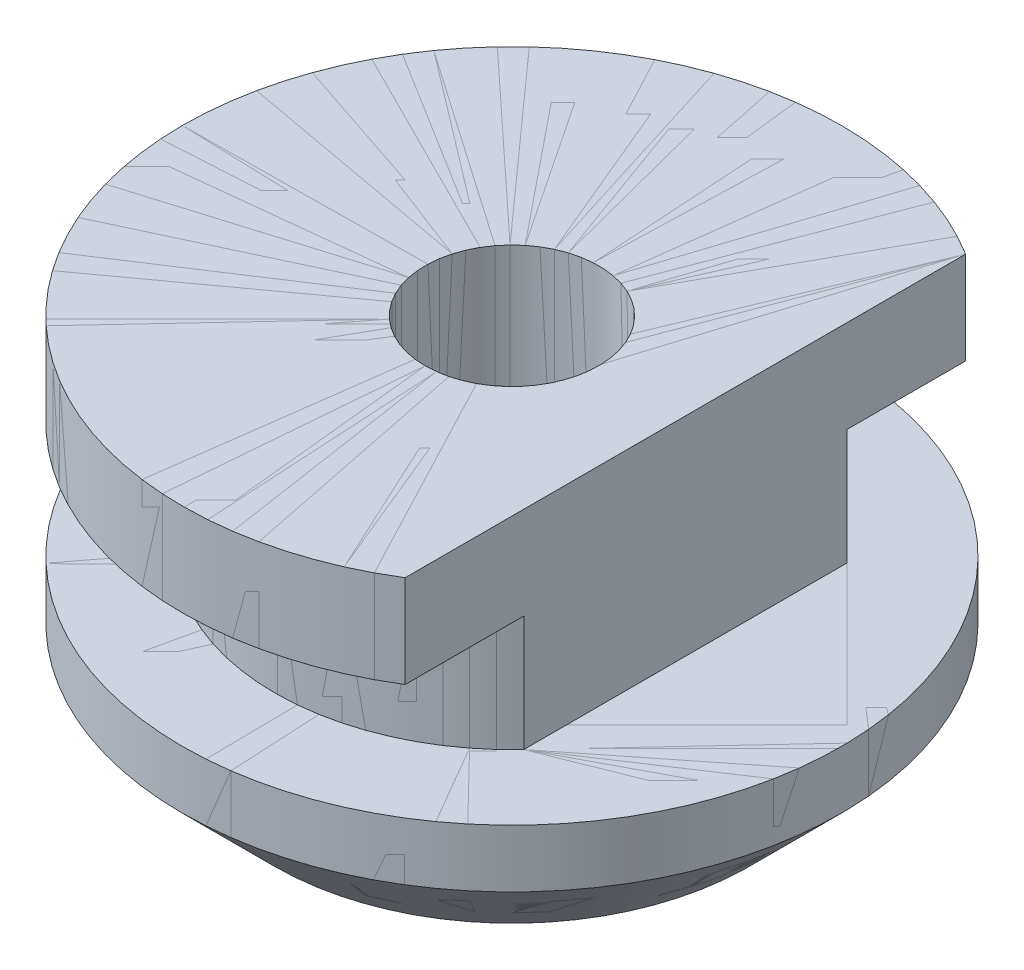
ISO-10303-21;
HEADER;
FILE_DESCRIPTION(('STEP AP214'),'2;1');
FILE_NAME('part.step','',(''),(''),'','','');
FILE_SCHEMA(('AUTOMOTIVE_DESIGN { 1 0 10303 214 1 1 1 1 }'));
ENDSEC;
DATA;
#1=APPLICATION_CONTEXT('core data for automotive mechanical design processes');
#2=APPLICATION_PROTOCOL_DEFINITION('international standard','automotive_design',2000,#1);
#3=PRODUCT_CONTEXT('',#1,'mechanical');
#4=PRODUCT('Part','Part','',(#3));
#5=PRODUCT_RELATED_PRODUCT_CATEGORY('part','',(#4));
#6=PRODUCT_DEFINITION_FORMATION('','',#4);
#7=PRODUCT_DEFINITION_CONTEXT('part definition',#1,'design');
#8=PRODUCT_DEFINITION('design','',#6,#7);
#9=PRODUCT_DEFINITION_SHAPE('','',#8);
#10=(LENGTH_UNIT() NAMED_UNIT(*) SI_UNIT(.MILLI.,.METRE.));
#11=(NAMED_UNIT(*) PLANE_ANGLE_UNIT() SI_UNIT($,.RADIAN.));
#12=(NAMED_UNIT(*) SI_UNIT($,.STERADIAN.) SOLID_ANGLE_UNIT());
#13=UNCERTAINTY_MEASURE_WITH_UNIT(LENGTH_MEASURE(1.E-05),#10,'distance_accuracy_value','');
#14=(GEOMETRIC_REPRESENTATION_CONTEXT(3) GLOBAL_UNCERTAINTY_ASSIGNED_CONTEXT((#13)) GLOBAL_UNIT_ASSIGNED_CONTEXT((#10,
#11,#12)) REPRESENTATION_CONTEXT('',''));
#15=CARTESIAN_POINT('',(0.,0.,0.));
#16=DIRECTION('',(0.,0.,1.));
#17=DIRECTION('',(1.,0.,0.));
#18=AXIS2_PLACEMENT_3D('',#15,#16,#17);
#19=CARTESIAN_POINT('',(0.,24.3464033391422,12.4551296144816));
#20=DIRECTION('',(0.,1.,0.));
#21=DIRECTION('',(0.,0.,1.));
#22=AXIS2_PLACEMENT_3D('',#19,#20,#21);
#23=CYLINDRICAL_SURFACE('',#22,7.5);
#24=CARTESIAN_POINT('',(0.,20.2588471559539,12.4551296144816));
#25=DIRECTION('',(0.,1.,0.));
#26=DIRECTION('',(0.,0.,1.));
#27=AXIS2_PLACEMENT_3D('',#24,#25,#26);
#28=CIRCLE('',#27,7.5);
#29=CARTESIAN_POINT('',(0.,20.2588471559539,19.9551296144816));
#30=VERTEX_POINT('',#29);
#31=EDGE_CURVE('E12',#30,#30,#28,.T.);
#32=ORIENTED_EDGE('',*,*,#31,.T.);
#33=EDGE_LOOP('',(#32));
#34=FACE_BOUND('',#33,.T.);
#35=CARTESIAN_POINT('',(0.,-0.741152844046081,12.4551296144816));
#36=DIRECTION('',(0.,1.,0.));
#37=DIRECTION('',(0.,0.,1.));
#38=AXIS2_PLACEMENT_3D('',#35,#36,#37);
#39=CIRCLE('',#38,7.5);
#40=CARTESIAN_POINT('',(0.,-0.741152844046082,19.9551296144816));
#41=VERTEX_POINT('',#40);
#42=EDGE_CURVE('E127',#41,#41,#39,.T.);
#43=ORIENTED_EDGE('',*,*,#42,.F.);
#44=EDGE_LOOP('',(#43));
#45=FACE_BOUND('',#44,.T.);
#46=ADVANCED_FACE('F43',(#34,#45),#23,.F.);
#47=CARTESIAN_POINT('',(0.,20.2588471559539,40.9551296144816));
#48=DIRECTION('',(0.,1.,0.));
#49=DIRECTION('',(0.,0.,1.));
#50=AXIS2_PLACEMENT_3D('',#47,#48,#49);
#51=PLANE('',#50);
#52=DIRECTION('',(0.,0.,1.));
#53=VECTOR('',#52,1.);
#54=CARTESIAN_POINT('',(15.,20.2588471559539,40.9551296144816));
#55=LINE('',#54,#53);
#56=CARTESIAN_POINT('',(15.,20.2588471559539,-11.7781120176237));
#57=VERTEX_POINT('',#56);
#58=CARTESIAN_POINT('',(15.,20.2588471559539,36.6883712465869));
#59=VERTEX_POINT('',#58);
#60=EDGE_CURVE('E113',#57,#59,#55,.T.);
#61=ORIENTED_EDGE('',*,*,#60,.F.);
#62=CARTESIAN_POINT('',(0.,20.2588471559539,12.4551296144816));
#63=DIRECTION('',(0.,1.,0.));
#64=DIRECTION('',(0.,0.,1.));
#65=AXIS2_PLACEMENT_3D('',#62,#63,#64);
#66=CIRCLE('',#65,28.5);
#67=EDGE_CURVE('E50',#57,#59,#66,.T.);
#68=ORIENTED_EDGE('',*,*,#67,.T.);
#69=EDGE_LOOP('',(#61,#68));
#70=FACE_BOUND('',#69,.T.);
#71=ORIENTED_EDGE('',*,*,#31,.F.);
#72=EDGE_LOOP('',(#71));
#73=FACE_BOUND('',#72,.T.);
#74=ADVANCED_FACE('F111',(#70,#73),#51,.T.);
#75=CARTESIAN_POINT('',(0.,24.3464033391422,12.4551296144816));
#76=DIRECTION('',(0.,1.,0.));
#77=DIRECTION('',(0.,0.,1.));
#78=AXIS2_PLACEMENT_3D('',#75,#76,#77);
#79=CYLINDRICAL_SURFACE('',#78,28.5);
#80=DIRECTION('',(0.,1.,0.));
#81=VECTOR('',#80,1.);
#82=CARTESIAN_POINT('',(15.,24.3464033391422,36.6883712465869));
#83=LINE('',#82,#81);
#84=CARTESIAN_POINT('',(15.,12.2588471559539,36.6883712465869));
#85=VERTEX_POINT('',#84);
#86=EDGE_CURVE('E120',#59,#85,#83,.F.);
#87=ORIENTED_EDGE('',*,*,#86,.F.);
#88=ORIENTED_EDGE('',*,*,#67,.F.);
#89=DIRECTION('',(0.,1.,0.));
#90=VECTOR('',#89,1.);
#91=CARTESIAN_POINT('',(15.,24.3464033391422,-11.7781120176237));
#92=LINE('',#91,#90);
#93=CARTESIAN_POINT('',(15.,12.2588471559539,-11.7781120176236));
#94=VERTEX_POINT('',#93);
#95=EDGE_CURVE('E118',#94,#57,#92,.T.);
#96=ORIENTED_EDGE('',*,*,#95,.F.);
#97=CARTESIAN_POINT('',(0.,12.2588471559539,12.4551296144816));
#98=DIRECTION('',(0.,1.,0.));
#99=DIRECTION('',(0.,0.,1.));
#100=AXIS2_PLACEMENT_3D('',#97,#98,#99);
#101=CIRCLE('',#100,28.5);
#102=EDGE_CURVE('E99',#94,#85,#101,.T.);
#103=ORIENTED_EDGE('',*,*,#102,.T.);
#104=EDGE_LOOP('',(#87,#88,#96,#103));
#105=FACE_BOUND('',#104,.T.);
#106=ADVANCED_FACE('F117',(#105),#79,.T.);
#107=CARTESIAN_POINT('',(0.,12.2588471559539,40.9551296144816));
#108=DIRECTION('',(0.,-1.,0.));
#109=DIRECTION('',(0.,0.,-1.));
#110=AXIS2_PLACEMENT_3D('',#107,#108,#109);
#111=PLANE('',#110);
#112=DIRECTION('',(0.,0.,-1.));
#113=VECTOR('',#112,1.);
#114=CARTESIAN_POINT('',(15.,12.2588471559539,40.9551296144816));
#115=LINE('',#114,#113);
#116=CARTESIAN_POINT('',(15.,12.2588471559539,26.4283182269638));
#117=VERTEX_POINT('',#116);
#118=EDGE_CURVE('E63',#85,#117,#115,.T.);
#119=ORIENTED_EDGE('',*,*,#118,.F.);
#120=ORIENTED_EDGE('',*,*,#102,.F.);
#121=CARTESIAN_POINT('',(15.,12.2588471559539,-1.5180589980005));
#122=VERTEX_POINT('',#121);
#123=EDGE_CURVE('E93',#122,#94,#115,.T.);
#124=ORIENTED_EDGE('',*,*,#123,.F.);
#125=CARTESIAN_POINT('',(0.,12.2588471559539,12.4551296144816));
#126=DIRECTION('',(0.,1.,0.));
#127=DIRECTION('',(0.,0.,1.));
#128=AXIS2_PLACEMENT_3D('',#125,#126,#127);
#129=CIRCLE('',#128,20.5);
#130=EDGE_CURVE('E92',#122,#117,#129,.T.);
#131=ORIENTED_EDGE('',*,*,#130,.T.);
#132=EDGE_LOOP('',(#119,#120,#124,#131));
#133=FACE_BOUND('',#132,.T.);
#134=ADVANCED_FACE('F201',(#133),#111,.T.);
#135=CARTESIAN_POINT('',(0.,24.3464033391422,12.4551296144816));
#136=DIRECTION('',(0.,1.,0.));
#137=DIRECTION('',(0.,0.,1.));
#138=AXIS2_PLACEMENT_3D('',#135,#136,#137);
#139=CYLINDRICAL_SURFACE('',#138,20.5);
#140=DIRECTION('',(0.,1.,0.));
#141=VECTOR('',#140,1.);
#142=CARTESIAN_POINT('',(15.,24.3464033391422,26.4283182269638));
#143=LINE('',#142,#141);
#144=CARTESIAN_POINT('',(15.,2.25884715595392,26.4283182269638));
#145=VERTEX_POINT('',#144);
#146=EDGE_CURVE('E84',#117,#145,#143,.F.);
#147=ORIENTED_EDGE('',*,*,#146,.F.);
#148=ORIENTED_EDGE('',*,*,#130,.F.);
#149=DIRECTION('',(0.,1.,0.));
#150=VECTOR('',#149,1.);
#151=CARTESIAN_POINT('',(15.,24.3464033391422,-1.5180589980005));
#152=LINE('',#151,#150);
#153=CARTESIAN_POINT('',(15.,2.25884715595392,-1.5180589980005));
#154=VERTEX_POINT('',#153);
#155=EDGE_CURVE('E82',#154,#122,#152,.T.);
#156=ORIENTED_EDGE('',*,*,#155,.F.);
#157=CARTESIAN_POINT('',(0.,2.25884715595392,12.4551296144816));
#158=DIRECTION('',(0.,1.,0.));
#159=DIRECTION('',(0.,0.,1.));
#160=AXIS2_PLACEMENT_3D('',#157,#158,#159);
#161=CIRCLE('',#160,20.5);
#162=EDGE_CURVE('E90',#154,#145,#161,.T.);
#163=ORIENTED_EDGE('',*,*,#162,.T.);
#164=EDGE_LOOP('',(#147,#148,#156,#163));
#165=FACE_BOUND('',#164,.T.);
#166=ADVANCED_FACE('F89',(#165),#139,.T.);
#167=CARTESIAN_POINT('',(0.,2.25884715595391,32.9551296144816));
#168=DIRECTION('',(0.,1.,0.));
#169=DIRECTION('',(0.,0.,1.));
#170=AXIS2_PLACEMENT_3D('',#167,#168,#169);
#171=PLANE('',#170);
#172=ORIENTED_EDGE('',*,*,#162,.F.);
#173=DIRECTION('',(0.,0.,1.));
#174=VECTOR('',#173,1.);
#175=CARTESIAN_POINT('',(15.,2.25884715595392,-16.0448703855184));
#176=LINE('',#175,#174);
#177=EDGE_CURVE('E56',#154,#145,#176,.T.);
#178=ORIENTED_EDGE('',*,*,#177,.T.);
#179=EDGE_LOOP('',(#172,#178));
#180=FACE_BOUND('',#179,.T.);
#181=CARTESIAN_POINT('',(0.,2.25884715595392,12.4551296144816));
#182=DIRECTION('',(0.,1.,0.));
#183=DIRECTION('',(0.,0.,1.));
#184=AXIS2_PLACEMENT_3D('',#181,#182,#183);
#185=CIRCLE('',#184,28.5);
#186=CARTESIAN_POINT('',(0.,2.25884715595392,40.9551296144816));
#187=VERTEX_POINT('',#186);
#188=EDGE_CURVE('E97',#187,#187,#185,.T.);
#189=ORIENTED_EDGE('',*,*,#188,.T.);
#190=EDGE_LOOP('',(#189));
#191=FACE_BOUND('',#190,.T.);
#192=ADVANCED_FACE('F95',(#180,#191),#171,.T.);
#193=CARTESIAN_POINT('',(0.,24.3464033391422,12.4551296144816));
#194=DIRECTION('',(0.,1.,0.));
#195=DIRECTION('',(0.,0.,1.));
#196=AXIS2_PLACEMENT_3D('',#193,#194,#195);
#197=CYLINDRICAL_SURFACE('',#196,28.5);
#198=CARTESIAN_POINT('',(0.,-2.74115284404608,12.4551296144816));
#199=DIRECTION('',(0.,1.,0.));
#200=DIRECTION('',(0.,0.,1.));
#201=AXIS2_PLACEMENT_3D('',#198,#199,#200);
#202=CIRCLE('',#201,28.5);
#203=CARTESIAN_POINT('',(0.,-2.74115284404609,40.9551296144816));
#204=VERTEX_POINT('',#203);
#205=EDGE_CURVE('E102',#204,#204,#202,.T.);
#206=ORIENTED_EDGE('',*,*,#205,.T.);
#207=EDGE_LOOP('',(#206));
#208=FACE_BOUND('',#207,.T.);
#209=ORIENTED_EDGE('',*,*,#188,.F.);
#210=EDGE_LOOP('',(#209));
#211=FACE_BOUND('',#210,.T.);
#212=ADVANCED_FACE('F138',(#208,#211),#197,.T.);
#213=CARTESIAN_POINT('',(0.,-2.74115284404608,12.4551296144816));
#214=DIRECTION('',(0.,1.,0.));
#215=DIRECTION('',(0.,0.,1.));
#216=AXIS2_PLACEMENT_3D('',#213,#214,#215);
#217=CONICAL_SURFACE('',#216,28.5,0.785398163397448);
#218=CARTESIAN_POINT('',(0.,-10.7411528440461,12.4551296144816));
#219=DIRECTION('',(0.,1.,0.));
#220=DIRECTION('',(0.,0.,1.));
#221=AXIS2_PLACEMENT_3D('',#218,#219,#220);
#222=CIRCLE('',#221,20.5);
#223=CARTESIAN_POINT('',(0.,-10.7411528440461,32.9551296144816));
#224=VERTEX_POINT('',#223);
#225=EDGE_CURVE('E133',#224,#224,#222,.T.);
#226=ORIENTED_EDGE('',*,*,#225,.T.);
#227=EDGE_LOOP('',(#226));
#228=FACE_BOUND('',#227,.T.);
#229=ORIENTED_EDGE('',*,*,#205,.F.);
#230=EDGE_LOOP('',(#229));
#231=FACE_BOUND('',#230,.T.);
#232=ADVANCED_FACE('F141',(#228,#231),#217,.T.);
#233=CARTESIAN_POINT('',(0.,-10.7411528440461,32.9551296144816));
#234=DIRECTION('',(0.,-1.,0.));
#235=DIRECTION('',(0.,0.,-1.));
#236=AXIS2_PLACEMENT_3D('',#233,#234,#235);
#237=PLANE('',#236);
#238=CARTESIAN_POINT('',(0.,-10.7411528440461,12.4551296144816));
#239=DIRECTION('',(0.,1.,0.));
#240=DIRECTION('',(0.,0.,1.));
#241=AXIS2_PLACEMENT_3D('',#238,#239,#240);
#242=CIRCLE('',#241,10.5);
#243=CARTESIAN_POINT('',(0.,-10.7411528440461,22.9551296144816));
#244=VERTEX_POINT('',#243);
#245=EDGE_CURVE('E130',#244,#244,#242,.T.);
#246=ORIENTED_EDGE('',*,*,#245,.T.);
#247=EDGE_LOOP('',(#246));
#248=FACE_BOUND('',#247,.T.);
#249=ORIENTED_EDGE('',*,*,#225,.F.);
#250=EDGE_LOOP('',(#249));
#251=FACE_BOUND('',#250,.T.);
#252=ADVANCED_FACE('F143',(#248,#251),#237,.T.);
#253=CARTESIAN_POINT('',(0.,-10.7411528440461,12.4551296144816));
#254=DIRECTION('',(0.,-1.,0.));
#255=DIRECTION('',(0.,0.,-1.));
#256=AXIS2_PLACEMENT_3D('',#253,#254,#255);
#257=CONICAL_SURFACE('',#256,10.5,0.291456794477867);
#258=ORIENTED_EDGE('',*,*,#42,.T.);
#259=EDGE_LOOP('',(#258));
#260=FACE_BOUND('',#259,.T.);
#261=ORIENTED_EDGE('',*,*,#245,.F.);
#262=EDGE_LOOP('',(#261));
#263=FACE_BOUND('',#262,.T.);
#264=ADVANCED_FACE('F150',(#260,#263),#257,.F.);
#265=CARTESIAN_POINT('',(15.,21.728943572417,-16.0448703855184));
#266=DIRECTION('',(-1.,0.,0.));
#267=DIRECTION('',(0.,-1.,0.));
#268=AXIS2_PLACEMENT_3D('',#265,#266,#267);
#269=PLANE('',#268);
#270=ORIENTED_EDGE('',*,*,#146,.T.);
#271=ORIENTED_EDGE('',*,*,#177,.F.);
#272=ORIENTED_EDGE('',*,*,#155,.T.);
#273=ORIENTED_EDGE('',*,*,#123,.T.);
#274=ORIENTED_EDGE('',*,*,#95,.T.);
#275=ORIENTED_EDGE('',*,*,#60,.T.);
#276=ORIENTED_EDGE('',*,*,#86,.T.);
#277=ORIENTED_EDGE('',*,*,#118,.T.);
#278=EDGE_LOOP('',(#270,#271,#272,#273,#274,#275,#276,#277));
#279=FACE_BOUND('',#278,.T.);
#280=ADVANCED_FACE('F81',(#279),#269,.F.);
#281=CLOSED_SHELL('',(#46,#74,#106,#134,#166,#192,#212,#232,#252,#264,#280));
#282=MANIFOLD_SOLID_BREP('B2',#281);
#283=CARTESIAN_POINT('',(0.,24.3464033391422,12.4551296144816));
#284=DIRECTION('',(0.,1.,0.));
#285=DIRECTION('',(0.,0.,1.));
#286=AXIS2_PLACEMENT_3D('',#283,#284,#285);
#287=CYLINDRICAL_SURFACE('',#286,28.5);
#288=CARTESIAN_POINT('',(0.,12.2588471559539,12.4551296144816));
#289=DIRECTION('',(0.,1.,0.));
#290=DIRECTION('',(0.,0.,1.));
#291=AXIS2_PLACEMENT_3D('',#288,#289,#290);
#292=CIRCLE('',#291,28.5);
#293=CARTESIAN_POINT('',(15.,12.2588471559539,-11.7781120176236));
#294=VERTEX_POINT('',#293);
#295=CARTESIAN_POINT('',(15.,12.2588471559539,36.6883712465869));
#296=VERTEX_POINT('',#295);
#297=EDGE_CURVE('E257',#294,#296,#292,.T.);
#298=ORIENTED_EDGE('',*,*,#297,.T.);
#299=DIRECTION('',(0.,1.,0.));
#300=VECTOR('',#299,1.);
#301=CARTESIAN_POINT('',(15.,24.3464033391422,36.6883712465869));
#302=LINE('',#301,#300);
#303=CARTESIAN_POINT('',(15.,20.2588471559539,36.6883712465869));
#304=VERTEX_POINT('',#303);
#305=EDGE_CURVE('E316',#296,#304,#302,.T.);
#306=ORIENTED_EDGE('',*,*,#305,.T.);
#307=CARTESIAN_POINT('',(0.,20.2588471559539,12.4551296144816));
#308=DIRECTION('',(0.,1.,0.));
#309=DIRECTION('',(0.,0.,1.));
#310=AXIS2_PLACEMENT_3D('',#307,#308,#309);
#311=CIRCLE('',#310,28.5);
#312=CARTESIAN_POINT('',(15.,20.2588471559539,-11.7781120176236));
#313=VERTEX_POINT('',#312);
#314=EDGE_CURVE('E327',#313,#304,#311,.T.);
#315=ORIENTED_EDGE('',*,*,#314,.F.);
#316=DIRECTION('',(0.,1.,0.));
#317=VECTOR('',#316,1.);
#318=CARTESIAN_POINT('',(15.,24.3464033391422,-11.7781120176236));
#319=LINE('',#318,#317);
#320=EDGE_CURVE('E264',#313,#294,#319,.F.);
#321=ORIENTED_EDGE('',*,*,#320,.T.);
#322=EDGE_LOOP('',(#298,#306,#315,#321));
#323=FACE_BOUND('',#322,.T.);
#324=ADVANCED_FACE('F250',(#323),#287,.T.);
#325=CARTESIAN_POINT('',(0.,12.2588471559539,-16.0448703855184));
#326=DIRECTION('',(0.,1.,0.));
#327=DIRECTION('',(0.,0.,1.));
#328=AXIS2_PLACEMENT_3D('',#325,#326,#327);
#329=PLANE('',#328);
#330=ORIENTED_EDGE('',*,*,#297,.F.);
#331=DIRECTION('',(0.,0.,1.));
#332=VECTOR('',#331,1.);
#333=CARTESIAN_POINT('',(15.,12.2588471559539,-16.0448703855184));
#334=LINE('',#333,#332);
#335=CARTESIAN_POINT('',(15.,12.2588471559539,-1.5180589980005));
#336=VERTEX_POINT('',#335);
#337=EDGE_CURVE('E300',#294,#336,#334,.T.);
#338=ORIENTED_EDGE('',*,*,#337,.T.);
#339=CARTESIAN_POINT('',(0.,12.2588471559539,12.4551296144816));
#340=DIRECTION('',(0.,1.,0.));
#341=DIRECTION('',(0.,0.,1.));
#342=AXIS2_PLACEMENT_3D('',#339,#340,#341);
#343=CIRCLE('',#342,20.5);
#344=CARTESIAN_POINT('',(15.,12.2588471559539,26.4283182269638));
#345=VERTEX_POINT('',#344);
#346=EDGE_CURVE('E299',#336,#345,#343,.T.);
#347=ORIENTED_EDGE('',*,*,#346,.T.);
#348=EDGE_CURVE('E321',#345,#296,#334,.T.);
#349=ORIENTED_EDGE('',*,*,#348,.T.);
#350=EDGE_LOOP('',(#330,#338,#347,#349));
#351=FACE_BOUND('',#350,.T.);
#352=ADVANCED_FACE('F320',(#351),#329,.F.);
#353=CARTESIAN_POINT('',(0.,24.3464033391422,12.4551296144816));
#354=DIRECTION('',(0.,1.,0.));
#355=DIRECTION('',(0.,0.,1.));
#356=AXIS2_PLACEMENT_3D('',#353,#354,#355);
#357=CYLINDRICAL_SURFACE('',#356,20.5);
#358=CARTESIAN_POINT('',(0.,2.25884715595392,12.4551296144816));
#359=DIRECTION('',(0.,1.,0.));
#360=DIRECTION('',(0.,0.,1.));
#361=AXIS2_PLACEMENT_3D('',#358,#359,#360);
#362=CIRCLE('',#361,20.5);
#363=CARTESIAN_POINT('',(15.,2.25884715595392,-1.5180589980005));
#364=VERTEX_POINT('',#363);
#365=CARTESIAN_POINT('',(15.,2.25884715595392,26.4283182269638));
#366=VERTEX_POINT('',#365);
#367=EDGE_CURVE('E297',#364,#366,#362,.T.);
#368=ORIENTED_EDGE('',*,*,#367,.T.);
#369=DIRECTION('',(0.,1.,0.));
#370=VECTOR('',#369,1.);
#371=CARTESIAN_POINT('',(15.,24.3464033391422,26.4283182269638));
#372=LINE('',#371,#370);
#373=EDGE_CURVE('E289',#366,#345,#372,.T.);
#374=ORIENTED_EDGE('',*,*,#373,.T.);
#375=ORIENTED_EDGE('',*,*,#346,.F.);
#376=DIRECTION('',(0.,1.,0.));
#377=VECTOR('',#376,1.);
#378=CARTESIAN_POINT('',(15.,24.3464033391422,-1.5180589980005));
#379=LINE('',#378,#377);
#380=EDGE_CURVE('E269',#336,#364,#379,.F.);
#381=ORIENTED_EDGE('',*,*,#380,.T.);
#382=EDGE_LOOP('',(#368,#374,#375,#381));
#383=FACE_BOUND('',#382,.T.);
#384=ADVANCED_FACE('F296',(#383),#357,.T.);
#385=CARTESIAN_POINT('',(0.,2.25884715595392,-8.04487038551838));
#386=DIRECTION('',(0.,-1.,0.));
#387=DIRECTION('',(0.,0.,-1.));
#388=AXIS2_PLACEMENT_3D('',#385,#386,#387);
#389=PLANE('',#388);
#390=ORIENTED_EDGE('',*,*,#367,.F.);
#391=DIRECTION('',(0.,0.,1.));
#392=VECTOR('',#391,1.);
#393=CARTESIAN_POINT('',(15.,2.25884715595392,-16.0448703855184));
#394=LINE('',#393,#392);
#395=EDGE_CURVE('E286',#364,#366,#394,.T.);
#396=ORIENTED_EDGE('',*,*,#395,.T.);
#397=EDGE_LOOP('',(#390,#396));
#398=FACE_BOUND('',#397,.T.);
#399=CARTESIAN_POINT('',(0.,2.25884715595392,12.4551296144816));
#400=DIRECTION('',(0.,1.,0.));
#401=DIRECTION('',(0.,0.,1.));
#402=AXIS2_PLACEMENT_3D('',#399,#400,#401);
#403=CIRCLE('',#402,28.5);
#404=CARTESIAN_POINT('',(0.,2.25884715595392,40.9551296144816));
#405=VERTEX_POINT('',#404);
#406=EDGE_CURVE('E304',#405,#405,#403,.T.);
#407=ORIENTED_EDGE('',*,*,#406,.T.);
#408=EDGE_LOOP('',(#407));
#409=FACE_BOUND('',#408,.T.);
#410=ADVANCED_FACE('F302',(#398,#409),#389,.F.);
#411=CARTESIAN_POINT('',(0.,24.3464033391422,12.4551296144816));
#412=DIRECTION('',(0.,1.,0.));
#413=DIRECTION('',(0.,0.,1.));
#414=AXIS2_PLACEMENT_3D('',#411,#412,#413);
#415=CYLINDRICAL_SURFACE('',#414,28.5);
#416=ORIENTED_EDGE('',*,*,#406,.F.);
#417=EDGE_LOOP('',(#416));
#418=FACE_BOUND('',#417,.T.);
#419=CARTESIAN_POINT('',(0.,-2.74115284404608,12.4551296144816));
#420=DIRECTION('',(0.,1.,0.));
#421=DIRECTION('',(0.,0.,1.));
#422=AXIS2_PLACEMENT_3D('',#419,#420,#421);
#423=CIRCLE('',#422,28.5);
#424=CARTESIAN_POINT('',(0.,-2.74115284404609,40.9551296144816));
#425=VERTEX_POINT('',#424);
#426=EDGE_CURVE('E308',#425,#425,#423,.T.);
#427=ORIENTED_EDGE('',*,*,#426,.T.);
#428=EDGE_LOOP('',(#427));
#429=FACE_BOUND('',#428,.T.);
#430=ADVANCED_FACE('F343',(#418,#429),#415,.T.);
#431=CARTESIAN_POINT('',(0.,-10.7411528440461,12.4551296144816));
#432=DIRECTION('',(0.,1.,0.));
#433=DIRECTION('',(0.,0.,1.));
#434=AXIS2_PLACEMENT_3D('',#431,#432,#433);
#435=CONICAL_SURFACE('',#434,20.5,0.785398163397448);
#436=ORIENTED_EDGE('',*,*,#426,.F.);
#437=EDGE_LOOP('',(#436));
#438=FACE_BOUND('',#437,.T.);
#439=CARTESIAN_POINT('',(0.,-10.7411528440461,12.4551296144816));
#440=DIRECTION('',(0.,1.,0.));
#441=DIRECTION('',(0.,0.,1.));
#442=AXIS2_PLACEMENT_3D('',#439,#440,#441);
#443=CIRCLE('',#442,20.5);
#444=CARTESIAN_POINT('',(0.,-10.7411528440461,32.9551296144816));
#445=VERTEX_POINT('',#444);
#446=EDGE_CURVE('E338',#445,#445,#443,.T.);
#447=ORIENTED_EDGE('',*,*,#446,.T.);
#448=EDGE_LOOP('',(#447));
#449=FACE_BOUND('',#448,.T.);
#450=ADVANCED_FACE('F345',(#438,#449),#435,.T.);
#451=CARTESIAN_POINT('',(0.,-10.7411528440461,-8.04487038551838));
#452=DIRECTION('',(0.,1.,0.));
#453=DIRECTION('',(0.,0.,1.));
#454=AXIS2_PLACEMENT_3D('',#451,#452,#453);
#455=PLANE('',#454);
#456=ORIENTED_EDGE('',*,*,#446,.F.);
#457=EDGE_LOOP('',(#456));
#458=FACE_BOUND('',#457,.T.);
#459=CARTESIAN_POINT('',(0.,-10.7411528440461,12.4551296144816));
#460=DIRECTION('',(0.,1.,0.));
#461=DIRECTION('',(0.,0.,1.));
#462=AXIS2_PLACEMENT_3D('',#459,#460,#461);
#463=CIRCLE('',#462,10.5);
#464=CARTESIAN_POINT('',(0.,-10.7411528440461,22.9551296144816));
#465=VERTEX_POINT('',#464);
#466=EDGE_CURVE('E335',#465,#465,#463,.T.);
#467=ORIENTED_EDGE('',*,*,#466,.T.);
#468=EDGE_LOOP('',(#467));
#469=FACE_BOUND('',#468,.T.);
#470=ADVANCED_FACE('F348',(#458,#469),#455,.F.);
#471=CARTESIAN_POINT('',(0.,-0.741152844046081,12.4551296144816));
#472=DIRECTION('',(0.,-1.,0.));
#473=DIRECTION('',(0.,0.,-1.));
#474=AXIS2_PLACEMENT_3D('',#471,#472,#473);
#475=CONICAL_SURFACE('',#474,7.5,0.291456794477867);
#476=ORIENTED_EDGE('',*,*,#466,.F.);
#477=EDGE_LOOP('',(#476));
#478=FACE_BOUND('',#477,.T.);
#479=CARTESIAN_POINT('',(0.,-0.741152844046081,12.4551296144816));
#480=DIRECTION('',(0.,1.,0.));
#481=DIRECTION('',(0.,0.,1.));
#482=AXIS2_PLACEMENT_3D('',#479,#480,#481);
#483=CIRCLE('',#482,7.5);
#484=CARTESIAN_POINT('',(0.,-0.741152844046082,19.9551296144816));
#485=VERTEX_POINT('',#484);
#486=EDGE_CURVE('E332',#485,#485,#483,.T.);
#487=ORIENTED_EDGE('',*,*,#486,.T.);
#488=EDGE_LOOP('',(#487));
#489=FACE_BOUND('',#488,.T.);
#490=ADVANCED_FACE('F354',(#478,#489),#475,.F.);
#491=CARTESIAN_POINT('',(0.,24.3464033391422,12.4551296144816));
#492=DIRECTION('',(0.,1.,0.));
#493=DIRECTION('',(0.,0.,1.));
#494=AXIS2_PLACEMENT_3D('',#491,#492,#493);
#495=CYLINDRICAL_SURFACE('',#494,7.5);
#496=ORIENTED_EDGE('',*,*,#486,.F.);
#497=EDGE_LOOP('',(#496));
#498=FACE_BOUND('',#497,.T.);
#499=CARTESIAN_POINT('',(0.,20.2588471559539,12.4551296144816));
#500=DIRECTION('',(0.,1.,0.));
#501=DIRECTION('',(0.,0.,1.));
#502=AXIS2_PLACEMENT_3D('',#499,#500,#501);
#503=CIRCLE('',#502,7.5);
#504=CARTESIAN_POINT('',(0.,20.2588471559539,19.9551296144816));
#505=VERTEX_POINT('',#504);
#506=EDGE_CURVE('E329',#505,#505,#503,.T.);
#507=ORIENTED_EDGE('',*,*,#506,.T.);
#508=EDGE_LOOP('',(#507));
#509=FACE_BOUND('',#508,.T.);
#510=ADVANCED_FACE('F360',(#498,#509),#495,.F.);
#511=CARTESIAN_POINT('',(0.,20.2588471559539,-16.0448703855184));
#512=DIRECTION('',(0.,-1.,0.));
#513=DIRECTION('',(0.,0.,-1.));
#514=AXIS2_PLACEMENT_3D('',#511,#512,#513);
#515=PLANE('',#514);
#516=ORIENTED_EDGE('',*,*,#506,.F.);
#517=EDGE_LOOP('',(#516));
#518=FACE_BOUND('',#517,.T.);
#519=ORIENTED_EDGE('',*,*,#314,.T.);
#520=DIRECTION('',(0.,0.,-1.));
#521=VECTOR('',#520,1.);
#522=CARTESIAN_POINT('',(15.,20.2588471559539,-16.0448703855184));
#523=LINE('',#522,#521);
#524=EDGE_CURVE('E41',#304,#313,#523,.T.);
#525=ORIENTED_EDGE('',*,*,#524,.T.);
#526=EDGE_LOOP('',(#519,#525));
#527=FACE_BOUND('',#526,.T.);
#528=ADVANCED_FACE('F366',(#518,#527),#515,.F.);
#529=CARTESIAN_POINT('',(15.,21.728943572417,-16.0448703855184));
#530=DIRECTION('',(-1.,0.,0.));
#531=DIRECTION('',(0.,-1.,0.));
#532=AXIS2_PLACEMENT_3D('',#529,#530,#531);
#533=PLANE('',#532);
#534=ORIENTED_EDGE('',*,*,#395,.F.);
#535=ORIENTED_EDGE('',*,*,#380,.F.);
#536=ORIENTED_EDGE('',*,*,#337,.F.);
#537=ORIENTED_EDGE('',*,*,#320,.F.);
#538=ORIENTED_EDGE('',*,*,#524,.F.);
#539=ORIENTED_EDGE('',*,*,#305,.F.);
#540=ORIENTED_EDGE('',*,*,#348,.F.);
#541=ORIENTED_EDGE('',*,*,#373,.F.);
#542=EDGE_LOOP('',(#534,#535,#536,#537,#538,#539,#540,#541));
#543=FACE_BOUND('',#542,.T.);
#544=ADVANCED_FACE('F287',(#543),#533,.F.);
#545=CLOSED_SHELL('',(#324,#352,#384,#410,#430,#450,#470,#490,#510,#528,#544));
#546=MANIFOLD_SOLID_BREP('B6',#545);
#547=ADVANCED_BREP_SHAPE_REPRESENTATION('',(#18,#282,#546),#14);
#548=SHAPE_DEFINITION_REPRESENTATION(#9,#547);
ENDSEC;
END-ISO-10303-21;
